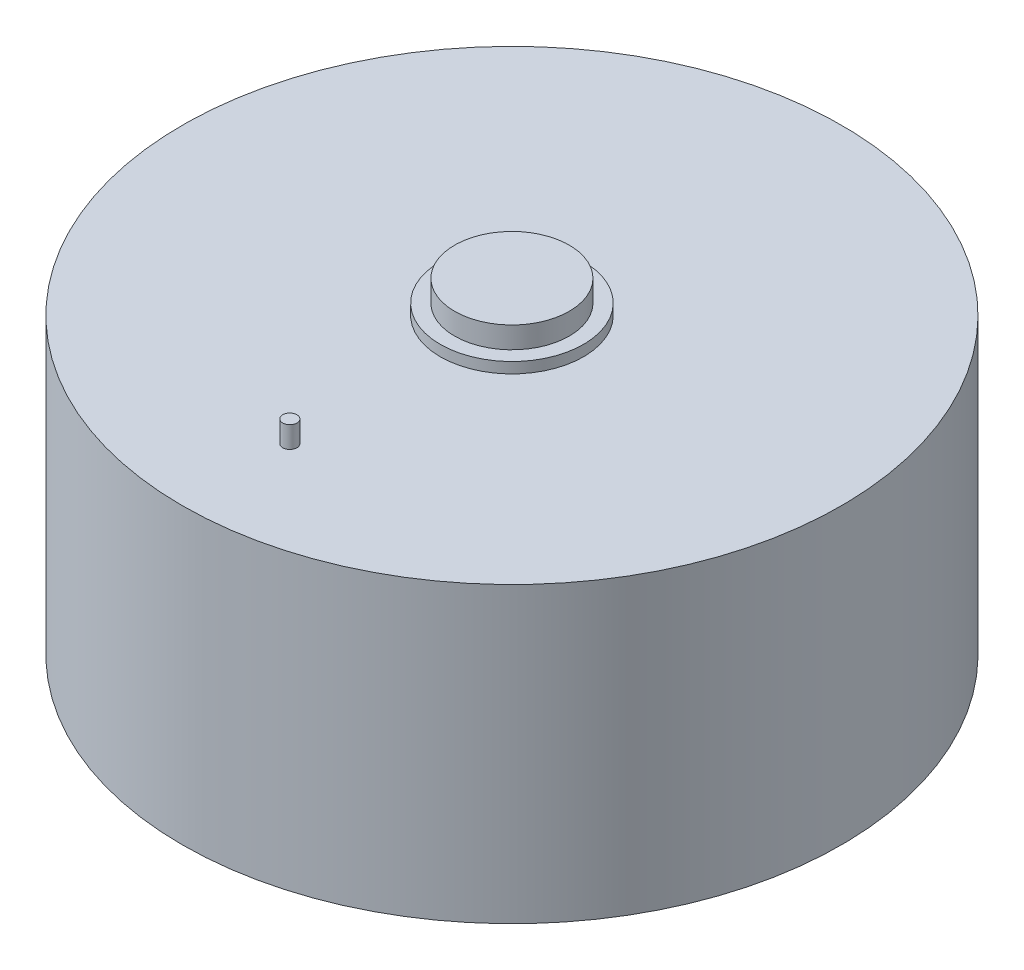
ISO-10303-21;
HEADER;
FILE_DESCRIPTION(('STEP AP214'),'2;1');
FILE_NAME('part.step','',(''),(''),'','','');
FILE_SCHEMA(('AUTOMOTIVE_DESIGN { 1 0 10303 214 1 1 1 1 }'));
ENDSEC;
DATA;
#1=APPLICATION_CONTEXT('core data for automotive mechanical design processes');
#2=APPLICATION_PROTOCOL_DEFINITION('international standard','automotive_design',2000,#1);
#3=PRODUCT_CONTEXT('',#1,'mechanical');
#4=PRODUCT('Part','Part','',(#3));
#5=PRODUCT_RELATED_PRODUCT_CATEGORY('part','',(#4));
#6=PRODUCT_DEFINITION_FORMATION('','',#4);
#7=PRODUCT_DEFINITION_CONTEXT('part definition',#1,'design');
#8=PRODUCT_DEFINITION('design','',#6,#7);
#9=PRODUCT_DEFINITION_SHAPE('','',#8);
#10=(LENGTH_UNIT() NAMED_UNIT(*) SI_UNIT(.MILLI.,.METRE.));
#11=(NAMED_UNIT(*) PLANE_ANGLE_UNIT() SI_UNIT($,.RADIAN.));
#12=(NAMED_UNIT(*) SI_UNIT($,.STERADIAN.) SOLID_ANGLE_UNIT());
#13=UNCERTAINTY_MEASURE_WITH_UNIT(LENGTH_MEASURE(1.E-05),#10,'distance_accuracy_value','');
#14=(GEOMETRIC_REPRESENTATION_CONTEXT(3) GLOBAL_UNCERTAINTY_ASSIGNED_CONTEXT((#13)) GLOBAL_UNIT_ASSIGNED_CONTEXT((#10,
#11,#12)) REPRESENTATION_CONTEXT('',''));
#15=CARTESIAN_POINT('',(0.,0.,0.));
#16=DIRECTION('',(0.,0.,1.));
#17=DIRECTION('',(1.,0.,0.));
#18=AXIS2_PLACEMENT_3D('',#15,#16,#17);
#19=CARTESIAN_POINT('',(0.,41.,0.));
#20=DIRECTION('',(0.,-1.,0.));
#21=DIRECTION('',(0.,0.,-1.));
#22=AXIS2_PLACEMENT_3D('',#19,#20,#21);
#23=CYLINDRICAL_SURFACE('',#22,46.);
#24=CARTESIAN_POINT('',(0.,41.,0.));
#25=DIRECTION('',(0.,1.,0.));
#26=DIRECTION('',(0.,0.,1.));
#27=AXIS2_PLACEMENT_3D('',#24,#25,#26);
#28=CIRCLE('',#27,46.);
#29=CARTESIAN_POINT('',(0.,41.,46.));
#30=VERTEX_POINT('',#29);
#31=EDGE_CURVE('E55',#30,#30,#28,.T.);
#32=ORIENTED_EDGE('',*,*,#31,.F.);
#33=EDGE_LOOP('',(#32));
#34=FACE_BOUND('',#33,.T.);
#35=CARTESIAN_POINT('',(0.,0.,0.));
#36=DIRECTION('',(0.,1.,0.));
#37=DIRECTION('',(0.,0.,1.));
#38=AXIS2_PLACEMENT_3D('',#35,#36,#37);
#39=CIRCLE('',#38,46.);
#40=CARTESIAN_POINT('',(0.,0.,46.));
#41=VERTEX_POINT('',#40);
#42=EDGE_CURVE('E46',#41,#41,#39,.T.);
#43=ORIENTED_EDGE('',*,*,#42,.T.);
#44=EDGE_LOOP('',(#43));
#45=FACE_BOUND('',#44,.T.);
#46=ADVANCED_FACE('F43',(#34,#45),#23,.T.);
#47=CARTESIAN_POINT('',(0.,41.,0.));
#48=DIRECTION('',(0.,1.,0.));
#49=DIRECTION('',(0.,0.,1.));
#50=AXIS2_PLACEMENT_3D('',#47,#48,#49);
#51=PLANE('',#50);
#52=CARTESIAN_POINT('',(0.,41.,31.));
#53=DIRECTION('',(0.,1.,0.));
#54=DIRECTION('',(0.,0.,1.));
#55=AXIS2_PLACEMENT_3D('',#52,#53,#54);
#56=CIRCLE('',#55,0.995);
#57=CARTESIAN_POINT('',(0.,41.,31.995));
#58=VERTEX_POINT('',#57);
#59=EDGE_CURVE('E159',#58,#58,#56,.T.);
#60=ORIENTED_EDGE('',*,*,#59,.F.);
#61=EDGE_LOOP('',(#60));
#62=FACE_BOUND('',#61,.T.);
#63=CARTESIAN_POINT('',(0.,41.,0.));
#64=DIRECTION('',(0.,1.,0.));
#65=DIRECTION('',(0.,0.,1.));
#66=AXIS2_PLACEMENT_3D('',#63,#64,#65);
#67=CIRCLE('',#66,10.);
#68=CARTESIAN_POINT('',(0.,41.,10.));
#69=VERTEX_POINT('',#68);
#70=EDGE_CURVE('E50',#69,#69,#67,.T.);
#71=ORIENTED_EDGE('',*,*,#70,.F.);
#72=EDGE_LOOP('',(#71));
#73=FACE_BOUND('',#72,.T.);
#74=ORIENTED_EDGE('',*,*,#31,.T.);
#75=EDGE_LOOP('',(#74));
#76=FACE_BOUND('',#75,.T.);
#77=ADVANCED_FACE('F73',(#62,#73,#76),#51,.T.);
#78=CARTESIAN_POINT('',(0.,0.,0.));
#79=DIRECTION('',(0.,1.,0.));
#80=DIRECTION('',(0.,0.,1.));
#81=AXIS2_PLACEMENT_3D('',#78,#79,#80);
#82=PLANE('',#81);
#83=ORIENTED_EDGE('',*,*,#42,.F.);
#84=EDGE_LOOP('',(#83));
#85=FACE_BOUND('',#84,.T.);
#86=ADVANCED_FACE('F70',(#85),#82,.F.);
#87=CARTESIAN_POINT('',(0.,42.5,0.));
#88=DIRECTION('',(0.,-1.,0.));
#89=DIRECTION('',(0.,0.,-1.));
#90=AXIS2_PLACEMENT_3D('',#87,#88,#89);
#91=CYLINDRICAL_SURFACE('',#90,10.);
#92=CARTESIAN_POINT('',(0.,42.5,0.));
#93=DIRECTION('',(0.,1.,0.));
#94=DIRECTION('',(0.,0.,1.));
#95=AXIS2_PLACEMENT_3D('',#92,#93,#94);
#96=CIRCLE('',#95,10.);
#97=CARTESIAN_POINT('',(0.,42.5,10.));
#98=VERTEX_POINT('',#97);
#99=EDGE_CURVE('E61',#98,#98,#96,.T.);
#100=ORIENTED_EDGE('',*,*,#99,.F.);
#101=EDGE_LOOP('',(#100));
#102=FACE_BOUND('',#101,.T.);
#103=ORIENTED_EDGE('',*,*,#70,.T.);
#104=EDGE_LOOP('',(#103));
#105=FACE_BOUND('',#104,.T.);
#106=ADVANCED_FACE('F72',(#102,#105),#91,.T.);
#107=CARTESIAN_POINT('',(0.,42.5,0.));
#108=DIRECTION('',(0.,1.,0.));
#109=DIRECTION('',(0.,0.,1.));
#110=AXIS2_PLACEMENT_3D('',#107,#108,#109);
#111=PLANE('',#110);
#112=CARTESIAN_POINT('',(0.,42.5,0.));
#113=DIRECTION('',(0.,1.,0.));
#114=DIRECTION('',(0.,0.,1.));
#115=AXIS2_PLACEMENT_3D('',#112,#113,#114);
#116=CIRCLE('',#115,8.);
#117=CARTESIAN_POINT('',(0.,42.5,8.));
#118=VERTEX_POINT('',#117);
#119=EDGE_CURVE('E10',#118,#118,#116,.T.);
#120=ORIENTED_EDGE('',*,*,#119,.F.);
#121=EDGE_LOOP('',(#120));
#122=FACE_BOUND('',#121,.T.);
#123=ORIENTED_EDGE('',*,*,#99,.T.);
#124=EDGE_LOOP('',(#123));
#125=FACE_BOUND('',#124,.T.);
#126=ADVANCED_FACE('F78',(#122,#125),#111,.T.);
#127=CARTESIAN_POINT('',(0.,45.5,0.));
#128=DIRECTION('',(0.,-1.,0.));
#129=DIRECTION('',(0.,0.,-1.));
#130=AXIS2_PLACEMENT_3D('',#127,#128,#129);
#131=CYLINDRICAL_SURFACE('',#130,8.);
#132=CARTESIAN_POINT('',(0.,45.5,0.));
#133=DIRECTION('',(0.,1.,0.));
#134=DIRECTION('',(0.,0.,1.));
#135=AXIS2_PLACEMENT_3D('',#132,#133,#134);
#136=CIRCLE('',#135,8.);
#137=CARTESIAN_POINT('',(0.,45.5,8.));
#138=VERTEX_POINT('',#137);
#139=EDGE_CURVE('E59',#138,#138,#136,.T.);
#140=ORIENTED_EDGE('',*,*,#139,.F.);
#141=EDGE_LOOP('',(#140));
#142=FACE_BOUND('',#141,.T.);
#143=ORIENTED_EDGE('',*,*,#119,.T.);
#144=EDGE_LOOP('',(#143));
#145=FACE_BOUND('',#144,.T.);
#146=ADVANCED_FACE('F115',(#142,#145),#131,.T.);
#147=CARTESIAN_POINT('',(0.,45.5,0.));
#148=DIRECTION('',(0.,1.,0.));
#149=DIRECTION('',(0.,0.,1.));
#150=AXIS2_PLACEMENT_3D('',#147,#148,#149);
#151=PLANE('',#150);
#152=ORIENTED_EDGE('',*,*,#139,.T.);
#153=EDGE_LOOP('',(#152));
#154=FACE_BOUND('',#153,.T.);
#155=ADVANCED_FACE('F125',(#154),#151,.T.);
#156=CARTESIAN_POINT('',(0.,44.,31.));
#157=DIRECTION('',(0.,-1.,0.));
#158=DIRECTION('',(0.,0.,-1.));
#159=AXIS2_PLACEMENT_3D('',#156,#157,#158);
#160=CYLINDRICAL_SURFACE('',#159,0.995);
#161=CARTESIAN_POINT('',(0.,44.,31.));
#162=DIRECTION('',(0.,1.,0.));
#163=DIRECTION('',(0.,0.,1.));
#164=AXIS2_PLACEMENT_3D('',#161,#162,#163);
#165=CIRCLE('',#164,0.995);
#166=CARTESIAN_POINT('',(0.,44.,31.995));
#167=VERTEX_POINT('',#166);
#168=EDGE_CURVE('E158',#167,#167,#165,.T.);
#169=ORIENTED_EDGE('',*,*,#168,.F.);
#170=EDGE_LOOP('',(#169));
#171=FACE_BOUND('',#170,.T.);
#172=ORIENTED_EDGE('',*,*,#59,.T.);
#173=EDGE_LOOP('',(#172));
#174=FACE_BOUND('',#173,.T.);
#175=ADVANCED_FACE('F134',(#171,#174),#160,.T.);
#176=CARTESIAN_POINT('',(0.,44.,31.));
#177=DIRECTION('',(0.,1.,0.));
#178=DIRECTION('',(0.,0.,1.));
#179=AXIS2_PLACEMENT_3D('',#176,#177,#178);
#180=PLANE('',#179);
#181=ORIENTED_EDGE('',*,*,#168,.T.);
#182=EDGE_LOOP('',(#181));
#183=FACE_BOUND('',#182,.T.);
#184=ADVANCED_FACE('F143',(#183),#180,.T.);
#185=CLOSED_SHELL('',(#46,#77,#86,#106,#126,#146,#155,#175,#184));
#186=MANIFOLD_SOLID_BREP('B2',#185);
#187=ADVANCED_BREP_SHAPE_REPRESENTATION('',(#18,#186),#14);
#188=SHAPE_DEFINITION_REPRESENTATION(#9,#187);
ENDSEC;
END-ISO-10303-21;
